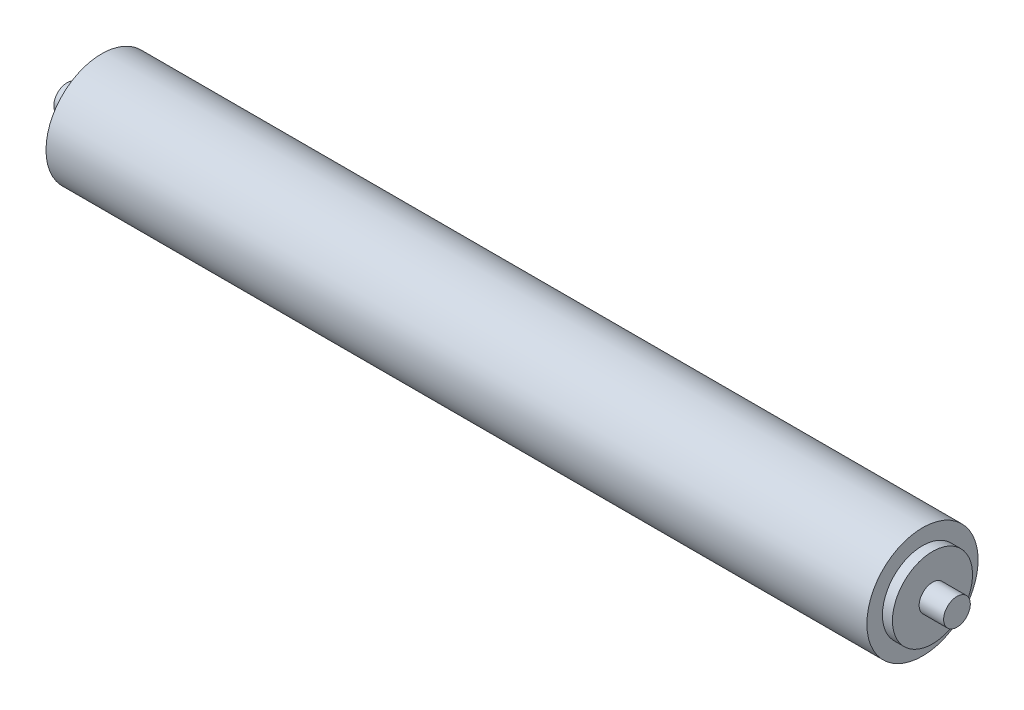
ISO-10303-21;
HEADER;
FILE_DESCRIPTION(('STEP AP214'),'2;1');
FILE_NAME('part.step','',(''),(''),'','','');
FILE_SCHEMA(('AUTOMOTIVE_DESIGN { 1 0 10303 214 1 1 1 1 }'));
ENDSEC;
DATA;
#1=APPLICATION_CONTEXT('core data for automotive mechanical design processes');
#2=APPLICATION_PROTOCOL_DEFINITION('international standard','automotive_design',2000,#1);
#3=PRODUCT_CONTEXT('',#1,'mechanical');
#4=PRODUCT('Part','Part','',(#3));
#5=PRODUCT_RELATED_PRODUCT_CATEGORY('part','',(#4));
#6=PRODUCT_DEFINITION_FORMATION('','',#4);
#7=PRODUCT_DEFINITION_CONTEXT('part definition',#1,'design');
#8=PRODUCT_DEFINITION('design','',#6,#7);
#9=PRODUCT_DEFINITION_SHAPE('','',#8);
#10=(LENGTH_UNIT() NAMED_UNIT(*) SI_UNIT(.MILLI.,.METRE.));
#11=(NAMED_UNIT(*) PLANE_ANGLE_UNIT() SI_UNIT($,.RADIAN.));
#12=(NAMED_UNIT(*) SI_UNIT($,.STERADIAN.) SOLID_ANGLE_UNIT());
#13=UNCERTAINTY_MEASURE_WITH_UNIT(LENGTH_MEASURE(1.E-05),#10,'distance_accuracy_value','');
#14=(GEOMETRIC_REPRESENTATION_CONTEXT(3) GLOBAL_UNCERTAINTY_ASSIGNED_CONTEXT((#13)) GLOBAL_UNIT_ASSIGNED_CONTEXT((#10,
#11,#12)) REPRESENTATION_CONTEXT('',''));
#15=CARTESIAN_POINT('',(0.,0.,0.));
#16=DIRECTION('',(0.,0.,1.));
#17=DIRECTION('',(1.,0.,0.));
#18=AXIS2_PLACEMENT_3D('',#15,#16,#17);
#19=CARTESIAN_POINT('',(0.,6.,0.));
#20=DIRECTION('',(1.,0.,0.));
#21=DIRECTION('',(0.,0.,-1.));
#22=AXIS2_PLACEMENT_3D('',#19,#20,#21);
#23=PLANE('',#22);
#24=CARTESIAN_POINT('',(0.,0.,0.));
#25=DIRECTION('',(-1.,0.,0.));
#26=DIRECTION('',(0.,0.,1.));
#27=AXIS2_PLACEMENT_3D('',#24,#25,#26);
#28=CIRCLE('',#27,6.);
#29=CARTESIAN_POINT('',(0.,0.,6.));
#30=VERTEX_POINT('',#29);
#31=EDGE_CURVE('E69',#30,#30,#28,.T.);
#32=ORIENTED_EDGE('',*,*,#31,.T.);
#33=EDGE_LOOP('',(#32));
#34=FACE_BOUND('',#33,.T.);
#35=ADVANCED_FACE('F35',(#34),#23,.F.);
#36=CARTESIAN_POINT('',(400.,6.,0.));
#37=DIRECTION('',(-1.,0.,0.));
#38=DIRECTION('',(0.,0.,1.));
#39=AXIS2_PLACEMENT_3D('',#36,#37,#38);
#40=PLANE('',#39);
#41=CARTESIAN_POINT('',(400.,0.,0.));
#42=DIRECTION('',(-1.,0.,0.));
#43=DIRECTION('',(0.,0.,1.));
#44=AXIS2_PLACEMENT_3D('',#41,#42,#43);
#45=CIRCLE('',#44,6.);
#46=CARTESIAN_POINT('',(400.,0.,6.));
#47=VERTEX_POINT('',#46);
#48=EDGE_CURVE('E10',#47,#47,#45,.T.);
#49=ORIENTED_EDGE('',*,*,#48,.F.);
#50=EDGE_LOOP('',(#49));
#51=FACE_BOUND('',#50,.T.);
#52=ADVANCED_FACE('F123',(#51),#40,.F.);
#53=CARTESIAN_POINT('',(0.,0.,0.));
#54=DIRECTION('',(-1.,0.,0.));
#55=DIRECTION('',(0.,0.,1.));
#56=AXIS2_PLACEMENT_3D('',#53,#54,#55);
#57=CYLINDRICAL_SURFACE('',#56,6.);
#58=CARTESIAN_POINT('',(389.,0.,0.));
#59=DIRECTION('',(-1.,0.,0.));
#60=DIRECTION('',(0.,0.,1.));
#61=AXIS2_PLACEMENT_3D('',#58,#59,#60);
#62=CIRCLE('',#61,6.);
#63=CARTESIAN_POINT('',(389.,0.,6.));
#64=VERTEX_POINT('',#63);
#65=EDGE_CURVE('E41',#64,#64,#62,.T.);
#66=ORIENTED_EDGE('',*,*,#65,.F.);
#67=EDGE_LOOP('',(#66));
#68=FACE_BOUND('',#67,.T.);
#69=ORIENTED_EDGE('',*,*,#48,.T.);
#70=EDGE_LOOP('',(#69));
#71=FACE_BOUND('',#70,.T.);
#72=ADVANCED_FACE('F118',(#68,#71),#57,.T.);
#73=CARTESIAN_POINT('',(389.,6.,0.));
#74=DIRECTION('',(-1.,0.,0.));
#75=DIRECTION('',(0.,0.,1.));
#76=AXIS2_PLACEMENT_3D('',#73,#74,#75);
#77=PLANE('',#76);
#78=CARTESIAN_POINT('',(389.,0.,0.));
#79=DIRECTION('',(-1.,0.,0.));
#80=DIRECTION('',(0.,0.,1.));
#81=AXIS2_PLACEMENT_3D('',#78,#79,#80);
#82=CIRCLE('',#81,18.);
#83=CARTESIAN_POINT('',(389.,0.,18.));
#84=VERTEX_POINT('',#83);
#85=EDGE_CURVE('E45',#84,#84,#82,.T.);
#86=ORIENTED_EDGE('',*,*,#85,.F.);
#87=EDGE_LOOP('',(#86));
#88=FACE_BOUND('',#87,.T.);
#89=ORIENTED_EDGE('',*,*,#65,.T.);
#90=EDGE_LOOP('',(#89));
#91=FACE_BOUND('',#90,.T.);
#92=ADVANCED_FACE('F113',(#88,#91),#77,.F.);
#93=CARTESIAN_POINT('',(0.,0.,0.));
#94=DIRECTION('',(-1.,0.,0.));
#95=DIRECTION('',(0.,0.,1.));
#96=AXIS2_PLACEMENT_3D('',#93,#94,#95);
#97=CYLINDRICAL_SURFACE('',#96,18.);
#98=CARTESIAN_POINT('',(384.5,0.,0.));
#99=DIRECTION('',(-1.,0.,0.));
#100=DIRECTION('',(0.,0.,1.));
#101=AXIS2_PLACEMENT_3D('',#98,#99,#100);
#102=CIRCLE('',#101,18.);
#103=CARTESIAN_POINT('',(384.5,0.,18.));
#104=VERTEX_POINT('',#103);
#105=EDGE_CURVE('E49',#104,#104,#102,.T.);
#106=ORIENTED_EDGE('',*,*,#105,.F.);
#107=EDGE_LOOP('',(#106));
#108=FACE_BOUND('',#107,.T.);
#109=ORIENTED_EDGE('',*,*,#85,.T.);
#110=EDGE_LOOP('',(#109));
#111=FACE_BOUND('',#110,.T.);
#112=ADVANCED_FACE('F107',(#108,#111),#97,.T.);
#113=CARTESIAN_POINT('',(384.5,25.,0.));
#114=DIRECTION('',(-1.,0.,0.));
#115=DIRECTION('',(0.,0.,1.));
#116=AXIS2_PLACEMENT_3D('',#113,#114,#115);
#117=PLANE('',#116);
#118=CARTESIAN_POINT('',(384.5,0.,0.));
#119=DIRECTION('',(-1.,0.,0.));
#120=DIRECTION('',(0.,0.,1.));
#121=AXIS2_PLACEMENT_3D('',#118,#119,#120);
#122=CIRCLE('',#121,25.);
#123=CARTESIAN_POINT('',(384.5,0.,25.));
#124=VERTEX_POINT('',#123);
#125=EDGE_CURVE('E54',#124,#124,#122,.T.);
#126=ORIENTED_EDGE('',*,*,#125,.F.);
#127=EDGE_LOOP('',(#126));
#128=FACE_BOUND('',#127,.T.);
#129=ORIENTED_EDGE('',*,*,#105,.T.);
#130=EDGE_LOOP('',(#129));
#131=FACE_BOUND('',#130,.T.);
#132=ADVANCED_FACE('F101',(#128,#131),#117,.F.);
#133=CARTESIAN_POINT('',(0.,0.,0.));
#134=DIRECTION('',(-1.,0.,0.));
#135=DIRECTION('',(0.,0.,1.));
#136=AXIS2_PLACEMENT_3D('',#133,#134,#135);
#137=CYLINDRICAL_SURFACE('',#136,25.);
#138=CARTESIAN_POINT('',(15.5,0.,0.));
#139=DIRECTION('',(-1.,0.,0.));
#140=DIRECTION('',(0.,0.,1.));
#141=AXIS2_PLACEMENT_3D('',#138,#139,#140);
#142=CIRCLE('',#141,25.);
#143=CARTESIAN_POINT('',(15.5,0.,25.));
#144=VERTEX_POINT('',#143);
#145=EDGE_CURVE('E57',#144,#144,#142,.T.);
#146=ORIENTED_EDGE('',*,*,#145,.F.);
#147=EDGE_LOOP('',(#146));
#148=FACE_BOUND('',#147,.T.);
#149=ORIENTED_EDGE('',*,*,#125,.T.);
#150=EDGE_LOOP('',(#149));
#151=FACE_BOUND('',#150,.T.);
#152=ADVANCED_FACE('F95',(#148,#151),#137,.T.);
#153=CARTESIAN_POINT('',(15.5,25.,0.));
#154=DIRECTION('',(1.,0.,0.));
#155=DIRECTION('',(0.,0.,-1.));
#156=AXIS2_PLACEMENT_3D('',#153,#154,#155);
#157=PLANE('',#156);
#158=CARTESIAN_POINT('',(15.5,0.,0.));
#159=DIRECTION('',(-1.,0.,0.));
#160=DIRECTION('',(0.,0.,1.));
#161=AXIS2_PLACEMENT_3D('',#158,#159,#160);
#162=CIRCLE('',#161,18.);
#163=CARTESIAN_POINT('',(15.5,0.,18.));
#164=VERTEX_POINT('',#163);
#165=EDGE_CURVE('E60',#164,#164,#162,.T.);
#166=ORIENTED_EDGE('',*,*,#165,.F.);
#167=EDGE_LOOP('',(#166));
#168=FACE_BOUND('',#167,.T.);
#169=ORIENTED_EDGE('',*,*,#145,.T.);
#170=EDGE_LOOP('',(#169));
#171=FACE_BOUND('',#170,.T.);
#172=ADVANCED_FACE('F89',(#168,#171),#157,.F.);
#173=CARTESIAN_POINT('',(0.,0.,0.));
#174=DIRECTION('',(-1.,0.,0.));
#175=DIRECTION('',(0.,0.,1.));
#176=AXIS2_PLACEMENT_3D('',#173,#174,#175);
#177=CYLINDRICAL_SURFACE('',#176,18.);
#178=CARTESIAN_POINT('',(11.,0.,0.));
#179=DIRECTION('',(-1.,0.,0.));
#180=DIRECTION('',(0.,0.,1.));
#181=AXIS2_PLACEMENT_3D('',#178,#179,#180);
#182=CIRCLE('',#181,18.);
#183=CARTESIAN_POINT('',(11.,0.,18.));
#184=VERTEX_POINT('',#183);
#185=EDGE_CURVE('E63',#184,#184,#182,.T.);
#186=ORIENTED_EDGE('',*,*,#185,.F.);
#187=EDGE_LOOP('',(#186));
#188=FACE_BOUND('',#187,.T.);
#189=ORIENTED_EDGE('',*,*,#165,.T.);
#190=EDGE_LOOP('',(#189));
#191=FACE_BOUND('',#190,.T.);
#192=ADVANCED_FACE('F83',(#188,#191),#177,.T.);
#193=CARTESIAN_POINT('',(11.,6.,0.));
#194=DIRECTION('',(1.,0.,0.));
#195=DIRECTION('',(0.,0.,-1.));
#196=AXIS2_PLACEMENT_3D('',#193,#194,#195);
#197=PLANE('',#196);
#198=CARTESIAN_POINT('',(11.,0.,0.));
#199=DIRECTION('',(-1.,0.,0.));
#200=DIRECTION('',(0.,0.,1.));
#201=AXIS2_PLACEMENT_3D('',#198,#199,#200);
#202=CIRCLE('',#201,6.);
#203=CARTESIAN_POINT('',(11.,0.,6.));
#204=VERTEX_POINT('',#203);
#205=EDGE_CURVE('E66',#204,#204,#202,.T.);
#206=ORIENTED_EDGE('',*,*,#205,.F.);
#207=EDGE_LOOP('',(#206));
#208=FACE_BOUND('',#207,.T.);
#209=ORIENTED_EDGE('',*,*,#185,.T.);
#210=EDGE_LOOP('',(#209));
#211=FACE_BOUND('',#210,.T.);
#212=ADVANCED_FACE('F77',(#208,#211),#197,.F.);
#213=CARTESIAN_POINT('',(0.,0.,0.));
#214=DIRECTION('',(-1.,0.,0.));
#215=DIRECTION('',(0.,0.,1.));
#216=AXIS2_PLACEMENT_3D('',#213,#214,#215);
#217=CYLINDRICAL_SURFACE('',#216,6.);
#218=ORIENTED_EDGE('',*,*,#31,.F.);
#219=EDGE_LOOP('',(#218));
#220=FACE_BOUND('',#219,.T.);
#221=ORIENTED_EDGE('',*,*,#205,.T.);
#222=EDGE_LOOP('',(#221));
#223=FACE_BOUND('',#222,.T.);
#224=ADVANCED_FACE('F74',(#220,#223),#217,.T.);
#225=CLOSED_SHELL('',(#35,#52,#72,#92,#112,#132,#152,#172,#192,#212,#224));
#226=MANIFOLD_SOLID_BREP('B2',#225);
#227=ADVANCED_BREP_SHAPE_REPRESENTATION('',(#18,#226),#14);
#228=SHAPE_DEFINITION_REPRESENTATION(#9,#227);
ENDSEC;
END-ISO-10303-21;
